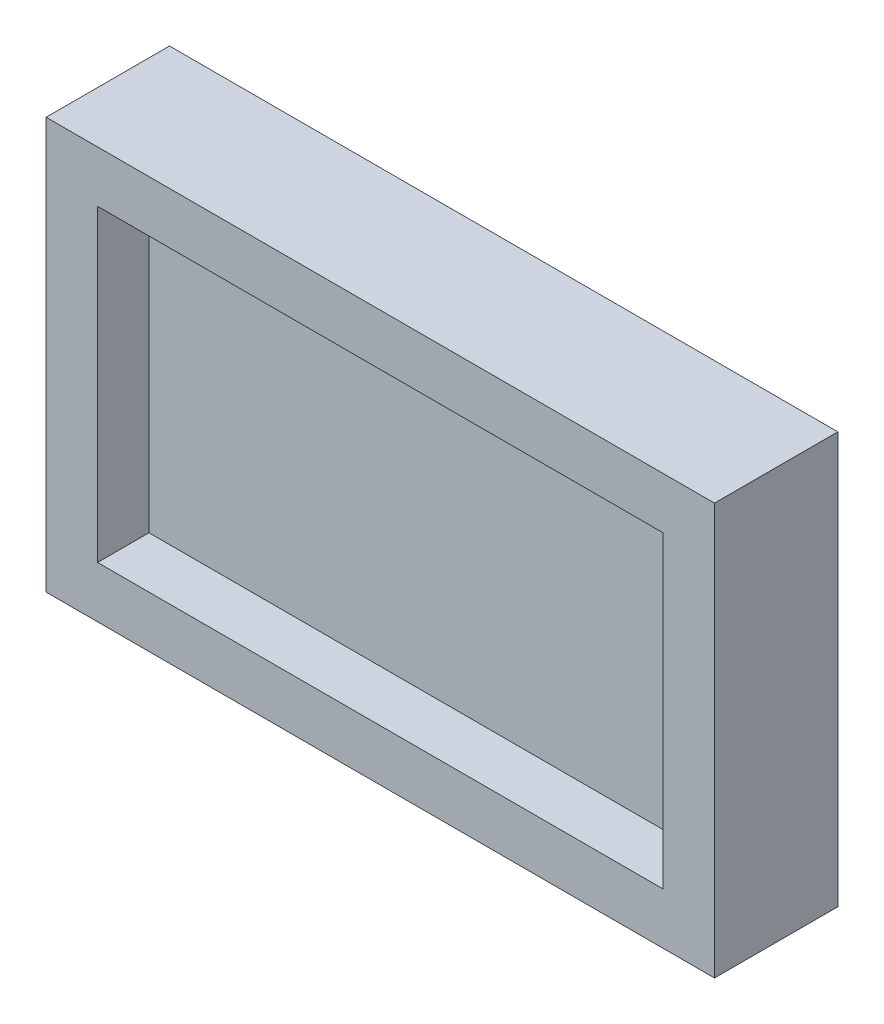
ISO-10303-21;
HEADER;
FILE_DESCRIPTION(('STEP AP214'),'2;1');
FILE_NAME('part.step','',(''),(''),'','','');
FILE_SCHEMA(('AUTOMOTIVE_DESIGN { 1 0 10303 214 1 1 1 1 }'));
ENDSEC;
DATA;
#1=APPLICATION_CONTEXT('core data for automotive mechanical design processes');
#2=APPLICATION_PROTOCOL_DEFINITION('international standard','automotive_design',2000,#1);
#3=PRODUCT_CONTEXT('',#1,'mechanical');
#4=PRODUCT('Part','Part','',(#3));
#5=PRODUCT_RELATED_PRODUCT_CATEGORY('part','',(#4));
#6=PRODUCT_DEFINITION_FORMATION('','',#4);
#7=PRODUCT_DEFINITION_CONTEXT('part definition',#1,'design');
#8=PRODUCT_DEFINITION('design','',#6,#7);
#9=PRODUCT_DEFINITION_SHAPE('','',#8);
#10=(LENGTH_UNIT() NAMED_UNIT(*) SI_UNIT(.MILLI.,.METRE.));
#11=(NAMED_UNIT(*) PLANE_ANGLE_UNIT() SI_UNIT($,.RADIAN.));
#12=(NAMED_UNIT(*) SI_UNIT($,.STERADIAN.) SOLID_ANGLE_UNIT());
#13=UNCERTAINTY_MEASURE_WITH_UNIT(LENGTH_MEASURE(1.E-05),#10,'distance_accuracy_value','');
#14=(GEOMETRIC_REPRESENTATION_CONTEXT(3) GLOBAL_UNCERTAINTY_ASSIGNED_CONTEXT((#13)) GLOBAL_UNIT_ASSIGNED_CONTEXT((#10,
#11,#12)) REPRESENTATION_CONTEXT('',''));
#15=CARTESIAN_POINT('',(0.,0.,0.));
#16=DIRECTION('',(0.,0.,1.));
#17=DIRECTION('',(1.,0.,0.));
#18=AXIS2_PLACEMENT_3D('',#15,#16,#17);
#19=CARTESIAN_POINT('',(-17.1111111111111,14.6222222222222,12.));
#20=DIRECTION('',(1.,0.,0.));
#21=DIRECTION('',(0.,0.,-1.));
#22=AXIS2_PLACEMENT_3D('',#19,#20,#21);
#23=PLANE('',#22);
#24=DIRECTION('',(0.,-1.,0.));
#25=VECTOR('',#24,1.);
#26=CARTESIAN_POINT('',(-17.1111111111111,14.6222222222222,0.));
#27=LINE('',#26,#25);
#28=CARTESIAN_POINT('',(-17.1111111111111,14.6222222222222,0.));
#29=VERTEX_POINT('',#28);
#30=CARTESIAN_POINT('',(-17.1111111111111,-25.3777777777778,0.));
#31=VERTEX_POINT('',#30);
#32=EDGE_CURVE('E141',#29,#31,#27,.T.);
#33=ORIENTED_EDGE('',*,*,#32,.T.);
#34=DIRECTION('',(0.,0.,-1.));
#35=VECTOR('',#34,1.);
#36=CARTESIAN_POINT('',(-17.1111111111111,-25.3777777777778,12.));
#37=LINE('',#36,#35);
#38=CARTESIAN_POINT('',(-17.1111111111111,-25.3777777777778,12.));
#39=VERTEX_POINT('',#38);
#40=EDGE_CURVE('E11',#39,#31,#37,.T.);
#41=ORIENTED_EDGE('',*,*,#40,.F.);
#42=DIRECTION('',(0.,-1.,0.));
#43=VECTOR('',#42,1.);
#44=CARTESIAN_POINT('',(-17.1111111111111,14.6222222222222,12.));
#45=LINE('',#44,#43);
#46=CARTESIAN_POINT('',(-17.1111111111111,14.6222222222222,12.));
#47=VERTEX_POINT('',#46);
#48=EDGE_CURVE('E145',#47,#39,#45,.T.);
#49=ORIENTED_EDGE('',*,*,#48,.F.);
#50=DIRECTION('',(0.,0.,-1.));
#51=VECTOR('',#50,1.);
#52=CARTESIAN_POINT('',(-17.1111111111111,14.6222222222222,12.));
#53=LINE('',#52,#51);
#54=EDGE_CURVE('E151',#47,#29,#53,.T.);
#55=ORIENTED_EDGE('',*,*,#54,.T.);
#56=EDGE_LOOP('',(#33,#41,#49,#55));
#57=FACE_BOUND('',#56,.T.);
#58=ADVANCED_FACE('F33',(#57),#23,.F.);
#59=CARTESIAN_POINT('',(-17.1111111111111,-25.3777777777778,12.));
#60=DIRECTION('',(0.,1.,0.));
#61=DIRECTION('',(0.,0.,1.));
#62=AXIS2_PLACEMENT_3D('',#59,#60,#61);
#63=PLANE('',#62);
#64=DIRECTION('',(1.,0.,0.));
#65=VECTOR('',#64,1.);
#66=CARTESIAN_POINT('',(-17.1111111111111,-25.3777777777778,0.));
#67=LINE('',#66,#65);
#68=CARTESIAN_POINT('',(47.8888888888889,-25.3777777777778,0.));
#69=VERTEX_POINT('',#68);
#70=EDGE_CURVE('E154',#31,#69,#67,.T.);
#71=ORIENTED_EDGE('',*,*,#70,.T.);
#72=DIRECTION('',(0.,0.,-1.));
#73=VECTOR('',#72,1.);
#74=CARTESIAN_POINT('',(47.8888888888889,-25.3777777777778,12.));
#75=LINE('',#74,#73);
#76=CARTESIAN_POINT('',(47.8888888888889,-25.3777777777778,12.));
#77=VERTEX_POINT('',#76);
#78=EDGE_CURVE('E40',#77,#69,#75,.T.);
#79=ORIENTED_EDGE('',*,*,#78,.F.);
#80=DIRECTION('',(1.,0.,0.));
#81=VECTOR('',#80,1.);
#82=CARTESIAN_POINT('',(-17.1111111111111,-25.3777777777778,12.));
#83=LINE('',#82,#81);
#84=EDGE_CURVE('E84',#39,#77,#83,.T.);
#85=ORIENTED_EDGE('',*,*,#84,.F.);
#86=ORIENTED_EDGE('',*,*,#40,.T.);
#87=EDGE_LOOP('',(#71,#79,#85,#86));
#88=FACE_BOUND('',#87,.T.);
#89=ADVANCED_FACE('F183',(#88),#63,.F.);
#90=CARTESIAN_POINT('',(47.8888888888889,14.6222222222222,12.));
#91=DIRECTION('',(-1.,0.,0.));
#92=DIRECTION('',(0.,-1.,0.));
#93=AXIS2_PLACEMENT_3D('',#90,#91,#92);
#94=PLANE('',#93);
#95=DIRECTION('',(0.,1.,0.));
#96=VECTOR('',#95,1.);
#97=CARTESIAN_POINT('',(47.8888888888889,14.6222222222222,0.));
#98=LINE('',#97,#96);
#99=CARTESIAN_POINT('',(47.8888888888889,14.6222222222222,0.));
#100=VERTEX_POINT('',#99);
#101=EDGE_CURVE('E156',#69,#100,#98,.T.);
#102=ORIENTED_EDGE('',*,*,#101,.T.);
#103=DIRECTION('',(0.,0.,-1.));
#104=VECTOR('',#103,1.);
#105=CARTESIAN_POINT('',(47.8888888888889,14.6222222222222,12.));
#106=LINE('',#105,#104);
#107=CARTESIAN_POINT('',(47.8888888888889,14.6222222222222,12.));
#108=VERTEX_POINT('',#107);
#109=EDGE_CURVE('E160',#108,#100,#106,.T.);
#110=ORIENTED_EDGE('',*,*,#109,.F.);
#111=DIRECTION('',(0.,1.,0.));
#112=VECTOR('',#111,1.);
#113=CARTESIAN_POINT('',(47.8888888888889,14.6222222222222,12.));
#114=LINE('',#113,#112);
#115=EDGE_CURVE('E148',#77,#108,#114,.T.);
#116=ORIENTED_EDGE('',*,*,#115,.F.);
#117=ORIENTED_EDGE('',*,*,#78,.T.);
#118=EDGE_LOOP('',(#102,#110,#116,#117));
#119=FACE_BOUND('',#118,.T.);
#120=ADVANCED_FACE('F165',(#119),#94,.F.);
#121=CARTESIAN_POINT('',(-17.1111111111111,14.6222222222222,12.));
#122=DIRECTION('',(0.,-1.,0.));
#123=DIRECTION('',(0.,0.,-1.));
#124=AXIS2_PLACEMENT_3D('',#121,#122,#123);
#125=PLANE('',#124);
#126=DIRECTION('',(-1.,0.,0.));
#127=VECTOR('',#126,1.);
#128=CARTESIAN_POINT('',(-17.1111111111111,14.6222222222222,0.));
#129=LINE('',#128,#127);
#130=EDGE_CURVE('E77',#100,#29,#129,.T.);
#131=ORIENTED_EDGE('',*,*,#130,.T.);
#132=ORIENTED_EDGE('',*,*,#54,.F.);
#133=DIRECTION('',(-1.,0.,0.));
#134=VECTOR('',#133,1.);
#135=CARTESIAN_POINT('',(-17.1111111111111,14.6222222222222,12.));
#136=LINE('',#135,#134);
#137=EDGE_CURVE('E56',#108,#47,#136,.T.);
#138=ORIENTED_EDGE('',*,*,#137,.F.);
#139=ORIENTED_EDGE('',*,*,#109,.T.);
#140=EDGE_LOOP('',(#131,#132,#138,#139));
#141=FACE_BOUND('',#140,.T.);
#142=ADVANCED_FACE('F173',(#141),#125,.F.);
#143=CARTESIAN_POINT('',(0.,0.,12.));
#144=DIRECTION('',(0.,0.,1.));
#145=DIRECTION('',(1.,0.,0.));
#146=AXIS2_PLACEMENT_3D('',#143,#144,#145);
#147=PLANE('',#146);
#148=DIRECTION('',(0.,-1.,0.));
#149=VECTOR('',#148,1.);
#150=CARTESIAN_POINT('',(-12.1111111111111,9.62222222222222,12.));
#151=LINE('',#150,#149);
#152=CARTESIAN_POINT('',(-12.1111111111111,9.62222222222222,12.));
#153=VERTEX_POINT('',#152);
#154=CARTESIAN_POINT('',(-12.1111111111111,-20.3777777777778,12.));
#155=VERTEX_POINT('',#154);
#156=EDGE_CURVE('E47',#153,#155,#151,.T.);
#157=ORIENTED_EDGE('',*,*,#156,.F.);
#158=DIRECTION('',(-1.,0.,0.));
#159=VECTOR('',#158,1.);
#160=CARTESIAN_POINT('',(-12.1111111111111,9.62222222222222,12.));
#161=LINE('',#160,#159);
#162=CARTESIAN_POINT('',(42.8888888888889,9.62222222222222,12.));
#163=VERTEX_POINT('',#162);
#164=EDGE_CURVE('E126',#163,#153,#161,.T.);
#165=ORIENTED_EDGE('',*,*,#164,.F.);
#166=DIRECTION('',(0.,1.,0.));
#167=VECTOR('',#166,1.);
#168=CARTESIAN_POINT('',(42.8888888888889,9.62222222222222,12.));
#169=LINE('',#168,#167);
#170=CARTESIAN_POINT('',(42.8888888888889,-20.3777777777778,12.));
#171=VERTEX_POINT('',#170);
#172=EDGE_CURVE('E129',#171,#163,#169,.T.);
#173=ORIENTED_EDGE('',*,*,#172,.F.);
#174=DIRECTION('',(1.,0.,0.));
#175=VECTOR('',#174,1.);
#176=CARTESIAN_POINT('',(-12.1111111111111,-20.3777777777778,12.));
#177=LINE('',#176,#175);
#178=EDGE_CURVE('E135',#155,#171,#177,.T.);
#179=ORIENTED_EDGE('',*,*,#178,.F.);
#180=EDGE_LOOP('',(#157,#165,#173,#179));
#181=FACE_BOUND('',#180,.T.);
#182=ORIENTED_EDGE('',*,*,#48,.T.);
#183=ORIENTED_EDGE('',*,*,#84,.T.);
#184=ORIENTED_EDGE('',*,*,#115,.T.);
#185=ORIENTED_EDGE('',*,*,#137,.T.);
#186=EDGE_LOOP('',(#182,#183,#184,#185));
#187=FACE_BOUND('',#186,.T.);
#188=ADVANCED_FACE('F175',(#181,#187),#147,.T.);
#189=CARTESIAN_POINT('',(0.,0.,0.));
#190=DIRECTION('',(0.,0.,1.));
#191=DIRECTION('',(1.,0.,0.));
#192=AXIS2_PLACEMENT_3D('',#189,#190,#191);
#193=PLANE('',#192);
#194=ORIENTED_EDGE('',*,*,#32,.F.);
#195=ORIENTED_EDGE('',*,*,#130,.F.);
#196=ORIENTED_EDGE('',*,*,#101,.F.);
#197=ORIENTED_EDGE('',*,*,#70,.F.);
#198=EDGE_LOOP('',(#194,#195,#196,#197));
#199=FACE_BOUND('',#198,.T.);
#200=ADVANCED_FACE('F169',(#199),#193,.F.);
#201=CARTESIAN_POINT('',(-12.1111111111111,9.62222222222222,7.));
#202=DIRECTION('',(-1.,0.,0.));
#203=DIRECTION('',(0.,-1.,0.));
#204=AXIS2_PLACEMENT_3D('',#201,#202,#203);
#205=PLANE('',#204);
#206=ORIENTED_EDGE('',*,*,#156,.T.);
#207=DIRECTION('',(0.,0.,1.));
#208=VECTOR('',#207,1.);
#209=CARTESIAN_POINT('',(-12.1111111111111,-20.3777777777778,7.));
#210=LINE('',#209,#208);
#211=CARTESIAN_POINT('',(-12.1111111111111,-20.3777777777778,7.));
#212=VERTEX_POINT('',#211);
#213=EDGE_CURVE('E104',#212,#155,#210,.T.);
#214=ORIENTED_EDGE('',*,*,#213,.F.);
#215=DIRECTION('',(0.,-1.,0.));
#216=VECTOR('',#215,1.);
#217=CARTESIAN_POINT('',(-12.1111111111111,9.62222222222222,7.));
#218=LINE('',#217,#216);
#219=CARTESIAN_POINT('',(-12.1111111111111,9.62222222222222,7.));
#220=VERTEX_POINT('',#219);
#221=EDGE_CURVE('E108',#220,#212,#218,.T.);
#222=ORIENTED_EDGE('',*,*,#221,.F.);
#223=DIRECTION('',(0.,0.,1.));
#224=VECTOR('',#223,1.);
#225=CARTESIAN_POINT('',(-12.1111111111111,9.62222222222222,7.));
#226=LINE('',#225,#224);
#227=EDGE_CURVE('E139',#220,#153,#226,.T.);
#228=ORIENTED_EDGE('',*,*,#227,.T.);
#229=EDGE_LOOP('',(#206,#214,#222,#228));
#230=FACE_BOUND('',#229,.T.);
#231=ADVANCED_FACE('F106',(#230),#205,.F.);
#232=CARTESIAN_POINT('',(-12.1111111111111,9.62222222222222,7.));
#233=DIRECTION('',(0.,1.,0.));
#234=DIRECTION('',(0.,0.,1.));
#235=AXIS2_PLACEMENT_3D('',#232,#233,#234);
#236=PLANE('',#235);
#237=ORIENTED_EDGE('',*,*,#164,.T.);
#238=ORIENTED_EDGE('',*,*,#227,.F.);
#239=DIRECTION('',(-1.,0.,0.));
#240=VECTOR('',#239,1.);
#241=CARTESIAN_POINT('',(-12.1111111111111,9.62222222222222,7.));
#242=LINE('',#241,#240);
#243=CARTESIAN_POINT('',(42.8888888888889,9.62222222222222,7.));
#244=VERTEX_POINT('',#243);
#245=EDGE_CURVE('E114',#244,#220,#242,.T.);
#246=ORIENTED_EDGE('',*,*,#245,.F.);
#247=DIRECTION('',(0.,0.,1.));
#248=VECTOR('',#247,1.);
#249=CARTESIAN_POINT('',(42.8888888888889,9.62222222222222,7.));
#250=LINE('',#249,#248);
#251=EDGE_CURVE('E142',#244,#163,#250,.T.);
#252=ORIENTED_EDGE('',*,*,#251,.T.);
#253=EDGE_LOOP('',(#237,#238,#246,#252));
#254=FACE_BOUND('',#253,.T.);
#255=ADVANCED_FACE('F222',(#254),#236,.F.);
#256=CARTESIAN_POINT('',(42.8888888888889,9.62222222222222,7.));
#257=DIRECTION('',(1.,0.,0.));
#258=DIRECTION('',(0.,1.,0.));
#259=AXIS2_PLACEMENT_3D('',#256,#257,#258);
#260=PLANE('',#259);
#261=ORIENTED_EDGE('',*,*,#172,.T.);
#262=ORIENTED_EDGE('',*,*,#251,.F.);
#263=DIRECTION('',(0.,1.,0.));
#264=VECTOR('',#263,1.);
#265=CARTESIAN_POINT('',(42.8888888888889,9.62222222222222,7.));
#266=LINE('',#265,#264);
#267=CARTESIAN_POINT('',(42.8888888888889,-20.3777777777778,7.));
#268=VERTEX_POINT('',#267);
#269=EDGE_CURVE('E122',#268,#244,#266,.T.);
#270=ORIENTED_EDGE('',*,*,#269,.F.);
#271=DIRECTION('',(0.,0.,1.));
#272=VECTOR('',#271,1.);
#273=CARTESIAN_POINT('',(42.8888888888889,-20.3777777777778,7.));
#274=LINE('',#273,#272);
#275=EDGE_CURVE('E113',#268,#171,#274,.T.);
#276=ORIENTED_EDGE('',*,*,#275,.T.);
#277=EDGE_LOOP('',(#261,#262,#270,#276));
#278=FACE_BOUND('',#277,.T.);
#279=ADVANCED_FACE('F231',(#278),#260,.F.);
#280=CARTESIAN_POINT('',(-12.1111111111111,-20.3777777777778,7.));
#281=DIRECTION('',(0.,-1.,0.));
#282=DIRECTION('',(0.,0.,-1.));
#283=AXIS2_PLACEMENT_3D('',#280,#281,#282);
#284=PLANE('',#283);
#285=ORIENTED_EDGE('',*,*,#178,.T.);
#286=ORIENTED_EDGE('',*,*,#275,.F.);
#287=DIRECTION('',(1.,0.,0.));
#288=VECTOR('',#287,1.);
#289=CARTESIAN_POINT('',(-12.1111111111111,-20.3777777777778,7.));
#290=LINE('',#289,#288);
#291=EDGE_CURVE('E117',#212,#268,#290,.T.);
#292=ORIENTED_EDGE('',*,*,#291,.F.);
#293=ORIENTED_EDGE('',*,*,#213,.T.);
#294=EDGE_LOOP('',(#285,#286,#292,#293));
#295=FACE_BOUND('',#294,.T.);
#296=ADVANCED_FACE('F118',(#295),#284,.F.);
#297=CARTESIAN_POINT('',(0.,0.,7.));
#298=DIRECTION('',(0.,0.,1.));
#299=DIRECTION('',(1.,0.,0.));
#300=AXIS2_PLACEMENT_3D('',#297,#298,#299);
#301=PLANE('',#300);
#302=ORIENTED_EDGE('',*,*,#221,.T.);
#303=ORIENTED_EDGE('',*,*,#291,.T.);
#304=ORIENTED_EDGE('',*,*,#269,.T.);
#305=ORIENTED_EDGE('',*,*,#245,.T.);
#306=EDGE_LOOP('',(#302,#303,#304,#305));
#307=FACE_BOUND('',#306,.T.);
#308=ADVANCED_FACE('F124',(#307),#301,.T.);
#309=CLOSED_SHELL('',(#58,#89,#120,#142,#188,#200,#231,#255,#279,#296,#308));
#310=MANIFOLD_SOLID_BREP('B2',#309);
#311=ADVANCED_BREP_SHAPE_REPRESENTATION('',(#18,#310),#14);
#312=SHAPE_DEFINITION_REPRESENTATION(#9,#311);
ENDSEC;
END-ISO-10303-21;
